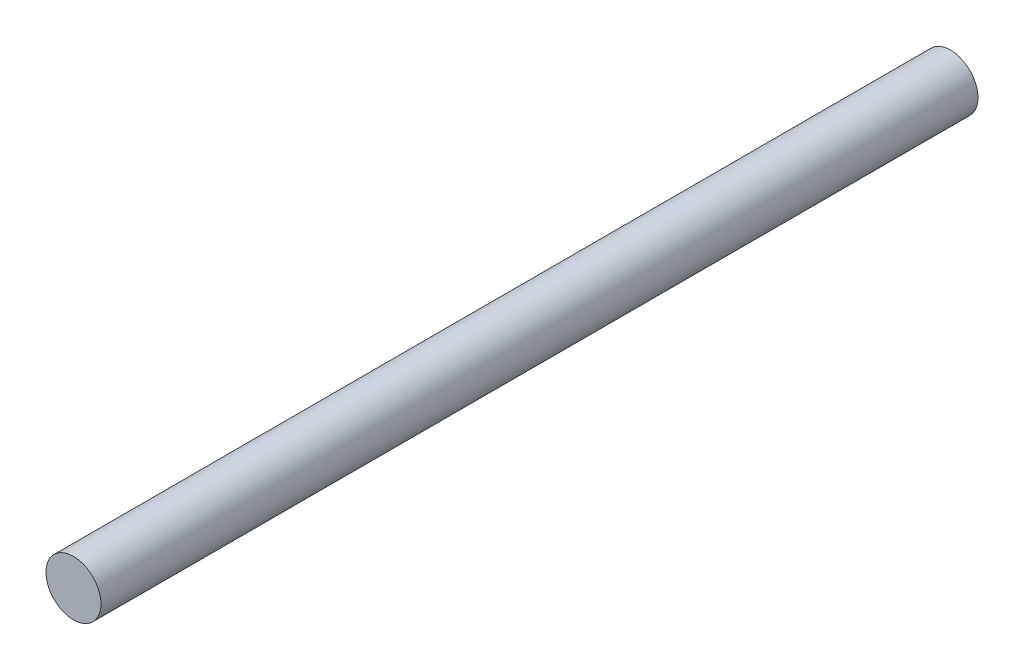
ISO-10303-21;
HEADER;
FILE_DESCRIPTION(('STEP AP214'),'2;1');
FILE_NAME('part.step','',(''),(''),'','','');
FILE_SCHEMA(('AUTOMOTIVE_DESIGN { 1 0 10303 214 1 1 1 1 }'));
ENDSEC;
DATA;
#1=APPLICATION_CONTEXT('core data for automotive mechanical design processes');
#2=APPLICATION_PROTOCOL_DEFINITION('international standard','automotive_design',2000,#1);
#3=PRODUCT_CONTEXT('',#1,'mechanical');
#4=PRODUCT('Part','Part','',(#3));
#5=PRODUCT_RELATED_PRODUCT_CATEGORY('part','',(#4));
#6=PRODUCT_DEFINITION_FORMATION('','',#4);
#7=PRODUCT_DEFINITION_CONTEXT('part definition',#1,'design');
#8=PRODUCT_DEFINITION('design','',#6,#7);
#9=PRODUCT_DEFINITION_SHAPE('','',#8);
#10=(LENGTH_UNIT() NAMED_UNIT(*) SI_UNIT(.MILLI.,.METRE.));
#11=(NAMED_UNIT(*) PLANE_ANGLE_UNIT() SI_UNIT($,.RADIAN.));
#12=(NAMED_UNIT(*) SI_UNIT($,.STERADIAN.) SOLID_ANGLE_UNIT());
#13=UNCERTAINTY_MEASURE_WITH_UNIT(LENGTH_MEASURE(1.E-05),#10,'distance_accuracy_value','');
#14=(GEOMETRIC_REPRESENTATION_CONTEXT(3) GLOBAL_UNCERTAINTY_ASSIGNED_CONTEXT((#13)) GLOBAL_UNIT_ASSIGNED_CONTEXT((#10,
#11,#12)) REPRESENTATION_CONTEXT('',''));
#15=CARTESIAN_POINT('',(0.,0.,0.));
#16=DIRECTION('',(0.,0.,1.));
#17=DIRECTION('',(1.,0.,0.));
#18=AXIS2_PLACEMENT_3D('',#15,#16,#17);
#19=CARTESIAN_POINT('',(0.,0.,79.72));
#20=DIRECTION('',(0.,0.,-1.));
#21=DIRECTION('',(-1.,0.,0.));
#22=AXIS2_PLACEMENT_3D('',#19,#20,#21);
#23=CYLINDRICAL_SURFACE('',#22,2.5);
#24=CARTESIAN_POINT('',(0.,0.,79.72));
#25=DIRECTION('',(0.,0.,1.));
#26=DIRECTION('',(1.,0.,0.));
#27=AXIS2_PLACEMENT_3D('',#24,#25,#26);
#28=CIRCLE('',#27,2.5);
#29=CARTESIAN_POINT('',(2.5,0.,79.72));
#30=VERTEX_POINT('',#29);
#31=EDGE_CURVE('E10',#30,#30,#28,.T.);
#32=ORIENTED_EDGE('',*,*,#31,.F.);
#33=EDGE_LOOP('',(#32));
#34=FACE_BOUND('',#33,.T.);
#35=CARTESIAN_POINT('',(0.,0.,0.));
#36=DIRECTION('',(0.,0.,1.));
#37=DIRECTION('',(1.,0.,0.));
#38=AXIS2_PLACEMENT_3D('',#35,#36,#37);
#39=CIRCLE('',#38,2.5);
#40=CARTESIAN_POINT('',(2.5,0.,0.));
#41=VERTEX_POINT('',#40);
#42=EDGE_CURVE('E33',#41,#41,#39,.T.);
#43=ORIENTED_EDGE('',*,*,#42,.T.);
#44=EDGE_LOOP('',(#43));
#45=FACE_BOUND('',#44,.T.);
#46=ADVANCED_FACE('F30',(#34,#45),#23,.T.);
#47=CARTESIAN_POINT('',(0.,0.,79.72));
#48=DIRECTION('',(0.,0.,1.));
#49=DIRECTION('',(1.,0.,0.));
#50=AXIS2_PLACEMENT_3D('',#47,#48,#49);
#51=PLANE('',#50);
#52=ORIENTED_EDGE('',*,*,#31,.T.);
#53=EDGE_LOOP('',(#52));
#54=FACE_BOUND('',#53,.T.);
#55=ADVANCED_FACE('F45',(#54),#51,.T.);
#56=CARTESIAN_POINT('',(0.,0.,0.));
#57=DIRECTION('',(0.,0.,1.));
#58=DIRECTION('',(1.,0.,0.));
#59=AXIS2_PLACEMENT_3D('',#56,#57,#58);
#60=PLANE('',#59);
#61=ORIENTED_EDGE('',*,*,#42,.F.);
#62=EDGE_LOOP('',(#61));
#63=FACE_BOUND('',#62,.T.);
#64=ADVANCED_FACE('F43',(#63),#60,.F.);
#65=CLOSED_SHELL('',(#46,#55,#64));
#66=MANIFOLD_SOLID_BREP('B2',#65);
#67=ADVANCED_BREP_SHAPE_REPRESENTATION('',(#18,#66),#14);
#68=SHAPE_DEFINITION_REPRESENTATION(#9,#67);
ENDSEC;
END-ISO-10303-21;
